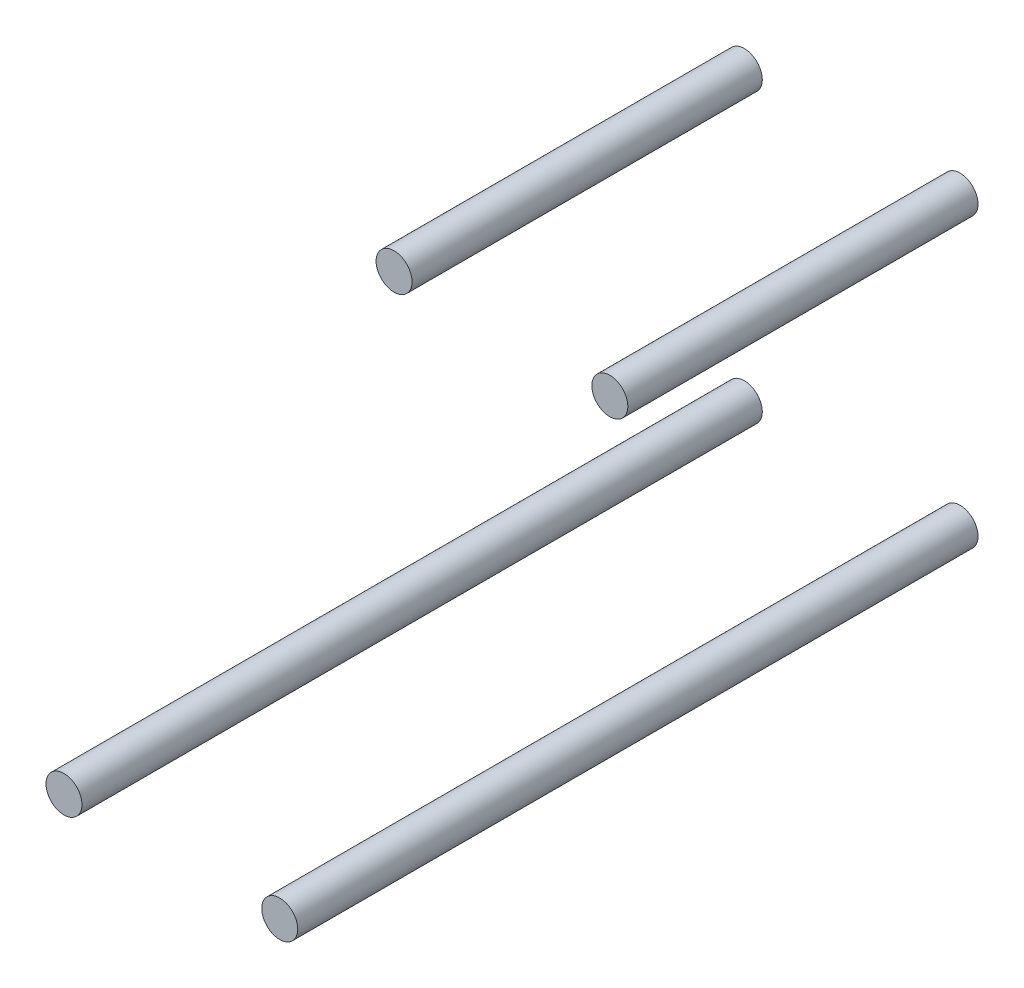
ISO-10303-21;
HEADER;
FILE_DESCRIPTION(('STEP AP214'),'2;1');
FILE_NAME('part.step','',(''),(''),'','','');
FILE_SCHEMA(('AUTOMOTIVE_DESIGN { 1 0 10303 214 1 1 1 1 }'));
ENDSEC;
DATA;
#1=APPLICATION_CONTEXT('core data for automotive mechanical design processes');
#2=APPLICATION_PROTOCOL_DEFINITION('international standard','automotive_design',2000,#1);
#3=PRODUCT_CONTEXT('',#1,'mechanical');
#4=PRODUCT('Part','Part','',(#3));
#5=PRODUCT_RELATED_PRODUCT_CATEGORY('part','',(#4));
#6=PRODUCT_DEFINITION_FORMATION('','',#4);
#7=PRODUCT_DEFINITION_CONTEXT('part definition',#1,'design');
#8=PRODUCT_DEFINITION('design','',#6,#7);
#9=PRODUCT_DEFINITION_SHAPE('','',#8);
#10=(LENGTH_UNIT() NAMED_UNIT(*) SI_UNIT(.MILLI.,.METRE.));
#11=(NAMED_UNIT(*) PLANE_ANGLE_UNIT() SI_UNIT($,.RADIAN.));
#12=(NAMED_UNIT(*) SI_UNIT($,.STERADIAN.) SOLID_ANGLE_UNIT());
#13=UNCERTAINTY_MEASURE_WITH_UNIT(LENGTH_MEASURE(1.E-05),#10,'distance_accuracy_value','');
#14=(GEOMETRIC_REPRESENTATION_CONTEXT(3) GLOBAL_UNCERTAINTY_ASSIGNED_CONTEXT((#13)) GLOBAL_UNIT_ASSIGNED_CONTEXT((#10,
#11,#12)) REPRESENTATION_CONTEXT('',''));
#15=CARTESIAN_POINT('',(0.,0.,0.));
#16=DIRECTION('',(0.,0.,1.));
#17=DIRECTION('',(1.,0.,0.));
#18=AXIS2_PLACEMENT_3D('',#15,#16,#17);
#19=CARTESIAN_POINT('',(3.82,5.,6.71));
#20=DIRECTION('',(0.,0.,-1.));
#21=DIRECTION('',(-1.,0.,0.));
#22=AXIS2_PLACEMENT_3D('',#19,#20,#21);
#23=PLANE('',#22);
#24=CARTESIAN_POINT('',(5.32,5.,6.71));
#25=DIRECTION('',(0.,0.,-1.));
#26=DIRECTION('',(-1.,0.,0.));
#27=AXIS2_PLACEMENT_3D('',#24,#25,#26);
#28=CIRCLE('',#27,0.25);
#29=CARTESIAN_POINT('',(5.07,5.,6.71));
#30=VERTEX_POINT('',#29);
#31=EDGE_CURVE('P0_E18',#30,#30,#28,.T.);
#32=ORIENTED_EDGE('',*,*,#31,.F.);
#33=EDGE_LOOP('',(#32));
#34=FACE_BOUND('',#33,.T.);
#35=ADVANCED_FACE('P0_F15',(#34),#23,.F.);
#36=CARTESIAN_POINT('',(3.82,5.,-2.75));
#37=DIRECTION('',(0.,0.,-1.));
#38=DIRECTION('',(-1.,0.,0.));
#39=AXIS2_PLACEMENT_3D('',#36,#37,#38);
#40=PLANE('',#39);
#41=CARTESIAN_POINT('',(5.32,5.,-2.75));
#42=DIRECTION('',(0.,0.,-1.));
#43=DIRECTION('',(-1.,0.,0.));
#44=AXIS2_PLACEMENT_3D('',#41,#42,#43);
#45=CIRCLE('',#44,0.25);
#46=CARTESIAN_POINT('',(5.07,5.,-2.75));
#47=VERTEX_POINT('',#46);
#48=EDGE_CURVE('P0_E10',#47,#47,#45,.F.);
#49=ORIENTED_EDGE('',*,*,#48,.F.);
#50=EDGE_LOOP('',(#49));
#51=FACE_BOUND('',#50,.T.);
#52=ADVANCED_FACE('P0_F30',(#51),#40,.T.);
#53=CARTESIAN_POINT('',(5.32,5.,6.71));
#54=DIRECTION('',(0.,0.,-1.));
#55=DIRECTION('',(-1.,0.,0.));
#56=AXIS2_PLACEMENT_3D('',#53,#54,#55);
#57=CYLINDRICAL_SURFACE('',#56,0.25);
#58=ORIENTED_EDGE('',*,*,#31,.T.);
#59=EDGE_LOOP('',(#58));
#60=FACE_BOUND('',#59,.T.);
#61=ORIENTED_EDGE('',*,*,#48,.T.);
#62=EDGE_LOOP('',(#61));
#63=FACE_BOUND('',#62,.T.);
#64=ADVANCED_FACE('P0_F27',(#60,#63),#57,.T.);
#65=CLOSED_SHELL('',(#35,#52,#64));
#66=MANIFOLD_SOLID_BREP('P0_B1',#65);
#67=CARTESIAN_POINT('',(15.75,7.,2.12));
#68=DIRECTION('',(0.,0.,1.));
#69=DIRECTION('',(1.,0.,0.));
#70=AXIS2_PLACEMENT_3D('',#67,#68,#69);
#71=PLANE('',#70);
#72=CARTESIAN_POINT('',(5.32,9.,2.12));
#73=DIRECTION('',(0.,0.,-1.));
#74=DIRECTION('',(-1.,0.,0.));
#75=AXIS2_PLACEMENT_3D('',#72,#73,#74);
#76=CIRCLE('',#75,0.25);
#77=CARTESIAN_POINT('',(5.07,9.,2.12));
#78=VERTEX_POINT('',#77);
#79=EDGE_CURVE('P1_E18',#78,#78,#76,.T.);
#80=ORIENTED_EDGE('',*,*,#79,.F.);
#81=EDGE_LOOP('',(#80));
#82=FACE_BOUND('',#81,.T.);
#83=ADVANCED_FACE('P1_F15',(#82),#71,.T.);
#84=CARTESIAN_POINT('',(3.82,5.,-2.75));
#85=DIRECTION('',(0.,0.,-1.));
#86=DIRECTION('',(-1.,0.,0.));
#87=AXIS2_PLACEMENT_3D('',#84,#85,#86);
#88=PLANE('',#87);
#89=CARTESIAN_POINT('',(5.32,9.,-2.75));
#90=DIRECTION('',(0.,0.,-1.));
#91=DIRECTION('',(-1.,0.,0.));
#92=AXIS2_PLACEMENT_3D('',#89,#90,#91);
#93=CIRCLE('',#92,0.25);
#94=CARTESIAN_POINT('',(5.07,9.,-2.75));
#95=VERTEX_POINT('',#94);
#96=EDGE_CURVE('P1_E10',#95,#95,#93,.F.);
#97=ORIENTED_EDGE('',*,*,#96,.F.);
#98=EDGE_LOOP('',(#97));
#99=FACE_BOUND('',#98,.T.);
#100=ADVANCED_FACE('P1_F30',(#99),#88,.T.);
#101=CARTESIAN_POINT('',(5.32,9.,6.71));
#102=DIRECTION('',(0.,0.,-1.));
#103=DIRECTION('',(-1.,0.,0.));
#104=AXIS2_PLACEMENT_3D('',#101,#102,#103);
#105=CYLINDRICAL_SURFACE('',#104,0.25);
#106=ORIENTED_EDGE('',*,*,#79,.T.);
#107=EDGE_LOOP('',(#106));
#108=FACE_BOUND('',#107,.T.);
#109=ORIENTED_EDGE('',*,*,#96,.T.);
#110=EDGE_LOOP('',(#109));
#111=FACE_BOUND('',#110,.T.);
#112=ADVANCED_FACE('P1_F27',(#108,#111),#105,.T.);
#113=CLOSED_SHELL('',(#83,#100,#112));
#114=MANIFOLD_SOLID_BREP('P1_B1',#113);
#115=CARTESIAN_POINT('',(15.75,7.,2.12));
#116=DIRECTION('',(0.,0.,1.));
#117=DIRECTION('',(1.,0.,0.));
#118=AXIS2_PLACEMENT_3D('',#115,#116,#117);
#119=PLANE('',#118);
#120=CARTESIAN_POINT('',(2.32,9.,2.12));
#121=DIRECTION('',(0.,0.,-1.));
#122=DIRECTION('',(-1.,0.,0.));
#123=AXIS2_PLACEMENT_3D('',#120,#121,#122);
#124=CIRCLE('',#123,0.25);
#125=CARTESIAN_POINT('',(2.07,9.,2.12));
#126=VERTEX_POINT('',#125);
#127=EDGE_CURVE('P2_E18',#126,#126,#124,.T.);
#128=ORIENTED_EDGE('',*,*,#127,.F.);
#129=EDGE_LOOP('',(#128));
#130=FACE_BOUND('',#129,.T.);
#131=ADVANCED_FACE('P2_F15',(#130),#119,.T.);
#132=CARTESIAN_POINT('',(3.82,5.,-2.75));
#133=DIRECTION('',(0.,0.,-1.));
#134=DIRECTION('',(-1.,0.,0.));
#135=AXIS2_PLACEMENT_3D('',#132,#133,#134);
#136=PLANE('',#135);
#137=CARTESIAN_POINT('',(2.32,9.,-2.75));
#138=DIRECTION('',(0.,0.,-1.));
#139=DIRECTION('',(-1.,0.,0.));
#140=AXIS2_PLACEMENT_3D('',#137,#138,#139);
#141=CIRCLE('',#140,0.25);
#142=CARTESIAN_POINT('',(2.07,9.,-2.75));
#143=VERTEX_POINT('',#142);
#144=EDGE_CURVE('P2_E10',#143,#143,#141,.F.);
#145=ORIENTED_EDGE('',*,*,#144,.F.);
#146=EDGE_LOOP('',(#145));
#147=FACE_BOUND('',#146,.T.);
#148=ADVANCED_FACE('P2_F30',(#147),#136,.T.);
#149=CARTESIAN_POINT('',(2.32,9.,6.71));
#150=DIRECTION('',(0.,0.,-1.));
#151=DIRECTION('',(-1.,0.,0.));
#152=AXIS2_PLACEMENT_3D('',#149,#150,#151);
#153=CYLINDRICAL_SURFACE('',#152,0.25);
#154=ORIENTED_EDGE('',*,*,#127,.T.);
#155=EDGE_LOOP('',(#154));
#156=FACE_BOUND('',#155,.T.);
#157=ORIENTED_EDGE('',*,*,#144,.T.);
#158=EDGE_LOOP('',(#157));
#159=FACE_BOUND('',#158,.T.);
#160=ADVANCED_FACE('P2_F27',(#156,#159),#153,.T.);
#161=CLOSED_SHELL('',(#131,#148,#160));
#162=MANIFOLD_SOLID_BREP('P2_B1',#161);
#163=CARTESIAN_POINT('',(3.82,5.,6.71));
#164=DIRECTION('',(0.,0.,-1.));
#165=DIRECTION('',(-1.,0.,0.));
#166=AXIS2_PLACEMENT_3D('',#163,#164,#165);
#167=PLANE('',#166);
#168=CARTESIAN_POINT('',(2.32,5.,6.71));
#169=DIRECTION('',(0.,0.,-1.));
#170=DIRECTION('',(-1.,0.,0.));
#171=AXIS2_PLACEMENT_3D('',#168,#169,#170);
#172=CIRCLE('',#171,0.25);
#173=CARTESIAN_POINT('',(2.07,5.,6.71));
#174=VERTEX_POINT('',#173);
#175=EDGE_CURVE('P3_E18',#174,#174,#172,.T.);
#176=ORIENTED_EDGE('',*,*,#175,.F.);
#177=EDGE_LOOP('',(#176));
#178=FACE_BOUND('',#177,.T.);
#179=ADVANCED_FACE('P3_F15',(#178),#167,.F.);
#180=CARTESIAN_POINT('',(3.82,5.,-2.75));
#181=DIRECTION('',(0.,0.,-1.));
#182=DIRECTION('',(-1.,0.,0.));
#183=AXIS2_PLACEMENT_3D('',#180,#181,#182);
#184=PLANE('',#183);
#185=CARTESIAN_POINT('',(2.32,5.,-2.75));
#186=DIRECTION('',(0.,0.,-1.));
#187=DIRECTION('',(-1.,0.,0.));
#188=AXIS2_PLACEMENT_3D('',#185,#186,#187);
#189=CIRCLE('',#188,0.25);
#190=CARTESIAN_POINT('',(2.07,5.,-2.75));
#191=VERTEX_POINT('',#190);
#192=EDGE_CURVE('P3_E10',#191,#191,#189,.F.);
#193=ORIENTED_EDGE('',*,*,#192,.F.);
#194=EDGE_LOOP('',(#193));
#195=FACE_BOUND('',#194,.T.);
#196=ADVANCED_FACE('P3_F30',(#195),#184,.T.);
#197=CARTESIAN_POINT('',(2.32,5.,6.71));
#198=DIRECTION('',(0.,0.,-1.));
#199=DIRECTION('',(-1.,0.,0.));
#200=AXIS2_PLACEMENT_3D('',#197,#198,#199);
#201=CYLINDRICAL_SURFACE('',#200,0.25);
#202=ORIENTED_EDGE('',*,*,#175,.T.);
#203=EDGE_LOOP('',(#202));
#204=FACE_BOUND('',#203,.T.);
#205=ORIENTED_EDGE('',*,*,#192,.T.);
#206=EDGE_LOOP('',(#205));
#207=FACE_BOUND('',#206,.T.);
#208=ADVANCED_FACE('P3_F27',(#204,#207),#201,.T.);
#209=CLOSED_SHELL('',(#179,#196,#208));
#210=MANIFOLD_SOLID_BREP('P3_B1',#209);
#211=ADVANCED_BREP_SHAPE_REPRESENTATION('',(#18,#66,#114,#162,#210),#14);
#212=SHAPE_DEFINITION_REPRESENTATION(#9,#211);
ENDSEC;
END-ISO-10303-21;
